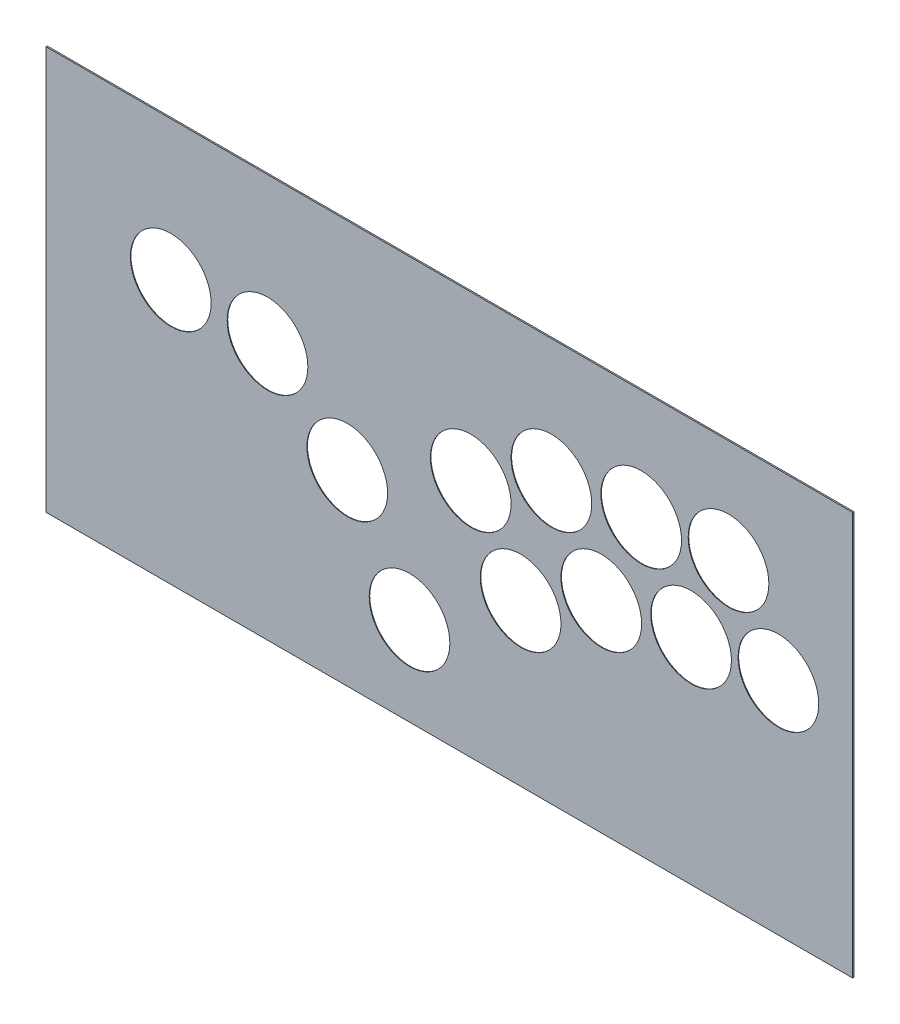
ISO-10303-21;
HEADER;
FILE_DESCRIPTION(('STEP AP214'),'2;1');
FILE_NAME('part.step','',(''),(''),'','','');
FILE_SCHEMA(('AUTOMOTIVE_DESIGN { 1 0 10303 214 1 1 1 1 }'));
ENDSEC;
DATA;
#1=APPLICATION_CONTEXT('core data for automotive mechanical design processes');
#2=APPLICATION_PROTOCOL_DEFINITION('international standard','automotive_design',2000,#1);
#3=PRODUCT_CONTEXT('',#1,'mechanical');
#4=PRODUCT('Part','Part','',(#3));
#5=PRODUCT_RELATED_PRODUCT_CATEGORY('part','',(#4));
#6=PRODUCT_DEFINITION_FORMATION('','',#4);
#7=PRODUCT_DEFINITION_CONTEXT('part definition',#1,'design');
#8=PRODUCT_DEFINITION('design','',#6,#7);
#9=PRODUCT_DEFINITION_SHAPE('','',#8);
#10=(LENGTH_UNIT() NAMED_UNIT(*) SI_UNIT(.MILLI.,.METRE.));
#11=(NAMED_UNIT(*) PLANE_ANGLE_UNIT() SI_UNIT($,.RADIAN.));
#12=(NAMED_UNIT(*) SI_UNIT($,.STERADIAN.) SOLID_ANGLE_UNIT());
#13=UNCERTAINTY_MEASURE_WITH_UNIT(LENGTH_MEASURE(1.E-05),#10,'distance_accuracy_value','');
#14=(GEOMETRIC_REPRESENTATION_CONTEXT(3) GLOBAL_UNCERTAINTY_ASSIGNED_CONTEXT((#13)) GLOBAL_UNIT_ASSIGNED_CONTEXT((#10,
#11,#12)) REPRESENTATION_CONTEXT('',''));
#15=CARTESIAN_POINT('',(0.,0.,0.));
#16=DIRECTION('',(0.,0.,1.));
#17=DIRECTION('',(1.,0.,0.));
#18=AXIS2_PLACEMENT_3D('',#15,#16,#17);
#19=CARTESIAN_POINT('',(0.,0.,8.));
#20=DIRECTION('',(0.,0.,-1.));
#21=DIRECTION('',(-1.,0.,0.));
#22=AXIS2_PLACEMENT_3D('',#19,#20,#21);
#23=PLANE('',#22);
#24=DIRECTION('',(0.,-1.,0.));
#25=VECTOR('',#24,1.);
#26=CARTESIAN_POINT('',(-2223.85023745411,-1021.97891702849,8.));
#27=LINE('',#26,#25);
#28=CARTESIAN_POINT('',(-2223.85023745411,1518.02108297151,8.));
#29=VERTEX_POINT('',#28);
#30=CARTESIAN_POINT('',(-2223.85023745411,-1021.97891702849,8.));
#31=VERTEX_POINT('',#30);
#32=EDGE_CURVE('E99',#29,#31,#27,.T.);
#33=ORIENTED_EDGE('',*,*,#32,.T.);
#34=DIRECTION('',(1.,0.,0.));
#35=VECTOR('',#34,1.);
#36=CARTESIAN_POINT('',(2856.14976254589,-1021.97891702849,8.));
#37=LINE('',#36,#35);
#38=CARTESIAN_POINT('',(2856.14976254589,-1021.97891702849,8.));
#39=VERTEX_POINT('',#38);
#40=EDGE_CURVE('E94',#31,#39,#37,.T.);
#41=ORIENTED_EDGE('',*,*,#40,.T.);
#42=DIRECTION('',(0.,1.,0.));
#43=VECTOR('',#42,1.);
#44=CARTESIAN_POINT('',(2856.14976254589,1518.02108297151,8.));
#45=LINE('',#44,#43);
#46=CARTESIAN_POINT('',(2856.14976254589,1518.02108297151,8.));
#47=VERTEX_POINT('',#46);
#48=EDGE_CURVE('E97',#39,#47,#45,.T.);
#49=ORIENTED_EDGE('',*,*,#48,.T.);
#50=DIRECTION('',(-1.,0.,0.));
#51=VECTOR('',#50,1.);
#52=CARTESIAN_POINT('',(-2223.85023745411,1518.02108297151,8.));
#53=LINE('',#52,#51);
#54=EDGE_CURVE('E64',#47,#29,#53,.T.);
#55=ORIENTED_EDGE('',*,*,#54,.T.);
#56=EDGE_LOOP('',(#33,#41,#49,#55));
#57=FACE_BOUND('',#56,.T.);
#58=CARTESIAN_POINT('',(-1438.69726844109,638.619730930492,8.));
#59=DIRECTION('',(0.,0.,1.));
#60=DIRECTION('',(1.,0.,0.));
#61=AXIS2_PLACEMENT_3D('',#58,#59,#60);
#62=CIRCLE('',#61,254.);
#63=CARTESIAN_POINT('',(-1184.69726844109,638.619730930492,8.));
#64=VERTEX_POINT('',#63);
#65=EDGE_CURVE('E125',#64,#64,#62,.T.);
#66=ORIENTED_EDGE('',*,*,#65,.F.);
#67=EDGE_LOOP('',(#66));
#68=FACE_BOUND('',#67,.T.);
#69=CARTESIAN_POINT('',(-829.234689966841,595.778397756596,8.));
#70=DIRECTION('',(0.,0.,1.));
#71=DIRECTION('',(1.,0.,0.));
#72=AXIS2_PLACEMENT_3D('',#69,#70,#71);
#73=CIRCLE('',#72,254.);
#74=CARTESIAN_POINT('',(-575.234689966841,595.778397756596,8.));
#75=VERTEX_POINT('',#74);
#76=EDGE_CURVE('E356',#75,#75,#73,.T.);
#77=ORIENTED_EDGE('',*,*,#76,.F.);
#78=EDGE_LOOP('',(#77));
#79=FACE_BOUND('',#78,.T.);
#80=CARTESIAN_POINT('',(-326.904160185785,157.844893080135,8.));
#81=DIRECTION('',(0.,0.,1.));
#82=DIRECTION('',(1.,0.,0.));
#83=AXIS2_PLACEMENT_3D('',#80,#81,#82);
#84=CIRCLE('',#83,254.);
#85=CARTESIAN_POINT('',(-72.9041601857845,157.844893080135,8.));
#86=VERTEX_POINT('',#85);
#87=EDGE_CURVE('E355',#86,#86,#84,.T.);
#88=ORIENTED_EDGE('',*,*,#87,.F.);
#89=EDGE_LOOP('',(#88));
#90=FACE_BOUND('',#89,.T.);
#91=CARTESIAN_POINT('',(65.1772087702372,-464.022155912422,8.));
#92=DIRECTION('',(0.,0.,1.));
#93=DIRECTION('',(1.,0.,0.));
#94=AXIS2_PLACEMENT_3D('',#91,#92,#93);
#95=CIRCLE('',#94,254.);
#96=CARTESIAN_POINT('',(319.177208770237,-464.022155912422,8.));
#97=VERTEX_POINT('',#96);
#98=EDGE_CURVE('E346',#97,#97,#95,.T.);
#99=ORIENTED_EDGE('',*,*,#98,.F.);
#100=EDGE_LOOP('',(#99));
#101=FACE_BOUND('',#100,.T.);
#102=CARTESIAN_POINT('',(450.852764313269,488.007227931822,8.));
#103=DIRECTION('',(0.,0.,1.));
#104=DIRECTION('',(1.,0.,0.));
#105=AXIS2_PLACEMENT_3D('',#102,#103,#104);
#106=CIRCLE('',#105,254.);
#107=CARTESIAN_POINT('',(704.852764313268,488.007227931822,8.));
#108=VERTEX_POINT('',#107);
#109=EDGE_CURVE('E344',#108,#108,#106,.T.);
#110=ORIENTED_EDGE('',*,*,#109,.F.);
#111=EDGE_LOOP('',(#110));
#112=FACE_BOUND('',#111,.T.);
#113=CARTESIAN_POINT('',(958.852764313268,742.007227931822,8.));
#114=DIRECTION('',(0.,0.,1.));
#115=DIRECTION('',(1.,0.,0.));
#116=AXIS2_PLACEMENT_3D('',#113,#114,#115);
#117=CIRCLE('',#116,254.);
#118=CARTESIAN_POINT('',(1212.85276431327,742.007227931822,8.));
#119=VERTEX_POINT('',#118);
#120=EDGE_CURVE('E338',#119,#119,#117,.T.);
#121=ORIENTED_EDGE('',*,*,#120,.F.);
#122=EDGE_LOOP('',(#121));
#123=FACE_BOUND('',#122,.T.);
#124=CARTESIAN_POINT('',(1524.55439569869,825.977687935269,8.));
#125=DIRECTION('',(0.,0.,1.));
#126=DIRECTION('',(1.,0.,0.));
#127=AXIS2_PLACEMENT_3D('',#124,#125,#126);
#128=CIRCLE('',#127,254.);
#129=CARTESIAN_POINT('',(1778.55439569869,825.977687935269,8.));
#130=VERTEX_POINT('',#129);
#131=EDGE_CURVE('E337',#130,#130,#128,.T.);
#132=ORIENTED_EDGE('',*,*,#131,.F.);
#133=EDGE_LOOP('',(#132));
#134=FACE_BOUND('',#133,.T.);
#135=CARTESIAN_POINT('',(2074.49917768818,864.058855361107,8.));
#136=DIRECTION('',(0.,0.,1.));
#137=DIRECTION('',(1.,0.,0.));
#138=AXIS2_PLACEMENT_3D('',#135,#136,#137);
#139=CIRCLE('',#138,254.);
#140=CARTESIAN_POINT('',(2328.49917768818,864.058855361107,8.));
#141=VERTEX_POINT('',#140);
#142=EDGE_CURVE('E335',#141,#141,#139,.T.);
#143=ORIENTED_EDGE('',*,*,#142,.F.);
#144=EDGE_LOOP('',(#143));
#145=FACE_BOUND('',#144,.T.);
#146=CARTESIAN_POINT('',(765.106903992089,-9.42811075742397,8.));
#147=DIRECTION('',(0.,0.,1.));
#148=DIRECTION('',(1.,0.,0.));
#149=AXIS2_PLACEMENT_3D('',#146,#147,#148);
#150=CIRCLE('',#149,254.);
#151=CARTESIAN_POINT('',(1019.10690399209,-9.42811075742397,8.));
#152=VERTEX_POINT('',#151);
#153=EDGE_CURVE('E326',#152,#152,#150,.T.);
#154=ORIENTED_EDGE('',*,*,#153,.F.);
#155=EDGE_LOOP('',(#154));
#156=FACE_BOUND('',#155,.T.);
#157=CARTESIAN_POINT('',(1273.10690399209,244.571889242576,8.));
#158=DIRECTION('',(0.,0.,1.));
#159=DIRECTION('',(1.,0.,0.));
#160=AXIS2_PLACEMENT_3D('',#157,#158,#159);
#161=CIRCLE('',#160,254.);
#162=CARTESIAN_POINT('',(1527.10690399209,244.571889242576,8.));
#163=VERTEX_POINT('',#162);
#164=EDGE_CURVE('E322',#163,#163,#161,.T.);
#165=ORIENTED_EDGE('',*,*,#164,.F.);
#166=EDGE_LOOP('',(#165));
#167=FACE_BOUND('',#166,.T.);
#168=CARTESIAN_POINT('',(1838.80853537751,328.542349246023,8.));
#169=DIRECTION('',(0.,0.,1.));
#170=DIRECTION('',(1.,0.,0.));
#171=AXIS2_PLACEMENT_3D('',#168,#169,#170);
#172=CIRCLE('',#171,254.);
#173=CARTESIAN_POINT('',(2092.80853537751,328.542349246023,8.));
#174=VERTEX_POINT('',#173);
#175=EDGE_CURVE('E318',#174,#174,#172,.T.);
#176=ORIENTED_EDGE('',*,*,#175,.F.);
#177=EDGE_LOOP('',(#176));
#178=FACE_BOUND('',#177,.T.);
#179=CARTESIAN_POINT('',(2388.753317367,366.623516671861,8.));
#180=DIRECTION('',(0.,0.,1.));
#181=DIRECTION('',(1.,0.,0.));
#182=AXIS2_PLACEMENT_3D('',#179,#180,#181);
#183=CIRCLE('',#182,254.);
#184=CARTESIAN_POINT('',(2642.753317367,366.623516671861,8.));
#185=VERTEX_POINT('',#184);
#186=EDGE_CURVE('E314',#185,#185,#183,.T.);
#187=ORIENTED_EDGE('',*,*,#186,.F.);
#188=EDGE_LOOP('',(#187));
#189=FACE_BOUND('',#188,.T.);
#190=ADVANCED_FACE('F44',(#57,#68,#79,#90,#101,#112,#123,#134,#145,#156,#167,#178,#189),#23,.F.);
#191=CARTESIAN_POINT('',(0.,0.,0.));
#192=DIRECTION('',(0.,0.,-1.));
#193=DIRECTION('',(-1.,0.,0.));
#194=AXIS2_PLACEMENT_3D('',#191,#192,#193);
#195=PLANE('',#194);
#196=CARTESIAN_POINT('',(-829.234689966841,595.778397756596,0.));
#197=DIRECTION('',(0.,0.,-1.));
#198=DIRECTION('',(-1.,0.,0.));
#199=AXIS2_PLACEMENT_3D('',#196,#197,#198);
#200=CIRCLE('',#199,259.);
#201=CARTESIAN_POINT('',(-1088.23468996684,595.778397756596,0.));
#202=VERTEX_POINT('',#201);
#203=EDGE_CURVE('E187',#202,#202,#200,.F.);
#204=ORIENTED_EDGE('',*,*,#203,.T.);
#205=EDGE_LOOP('',(#204));
#206=FACE_BOUND('',#205,.T.);
#207=CARTESIAN_POINT('',(-1438.69726844109,638.619730930492,0.));
#208=DIRECTION('',(0.,0.,-1.));
#209=DIRECTION('',(-1.,0.,0.));
#210=AXIS2_PLACEMENT_3D('',#207,#208,#209);
#211=CIRCLE('',#210,259.);
#212=CARTESIAN_POINT('',(-1697.69726844109,638.619730930492,0.));
#213=VERTEX_POINT('',#212);
#214=EDGE_CURVE('E182',#213,#213,#211,.F.);
#215=ORIENTED_EDGE('',*,*,#214,.T.);
#216=EDGE_LOOP('',(#215));
#217=FACE_BOUND('',#216,.T.);
#218=CARTESIAN_POINT('',(-326.904160185785,157.844893080135,0.));
#219=DIRECTION('',(0.,0.,-1.));
#220=DIRECTION('',(-1.,0.,0.));
#221=AXIS2_PLACEMENT_3D('',#218,#219,#220);
#222=CIRCLE('',#221,259.);
#223=CARTESIAN_POINT('',(-585.904160185785,157.844893080135,0.));
#224=VERTEX_POINT('',#223);
#225=EDGE_CURVE('E179',#224,#224,#222,.F.);
#226=ORIENTED_EDGE('',*,*,#225,.T.);
#227=EDGE_LOOP('',(#226));
#228=FACE_BOUND('',#227,.T.);
#229=CARTESIAN_POINT('',(65.1772087702372,-464.022155912422,0.));
#230=DIRECTION('',(0.,0.,-1.));
#231=DIRECTION('',(-1.,0.,0.));
#232=AXIS2_PLACEMENT_3D('',#229,#230,#231);
#233=CIRCLE('',#232,259.);
#234=CARTESIAN_POINT('',(-193.822791229763,-464.022155912422,0.));
#235=VERTEX_POINT('',#234);
#236=EDGE_CURVE('E180',#235,#235,#233,.F.);
#237=ORIENTED_EDGE('',*,*,#236,.T.);
#238=EDGE_LOOP('',(#237));
#239=FACE_BOUND('',#238,.T.);
#240=CARTESIAN_POINT('',(450.852764313269,488.007227931822,0.));
#241=DIRECTION('',(0.,0.,-1.));
#242=DIRECTION('',(-1.,0.,0.));
#243=AXIS2_PLACEMENT_3D('',#240,#241,#242);
#244=CIRCLE('',#243,259.);
#245=CARTESIAN_POINT('',(191.852764313268,488.007227931822,0.));
#246=VERTEX_POINT('',#245);
#247=EDGE_CURVE('E171',#246,#246,#244,.F.);
#248=ORIENTED_EDGE('',*,*,#247,.T.);
#249=EDGE_LOOP('',(#248));
#250=FACE_BOUND('',#249,.T.);
#251=CARTESIAN_POINT('',(765.106903992089,-9.42811075742397,0.));
#252=DIRECTION('',(0.,0.,-1.));
#253=DIRECTION('',(-1.,0.,0.));
#254=AXIS2_PLACEMENT_3D('',#251,#252,#253);
#255=CIRCLE('',#254,259.);
#256=CARTESIAN_POINT('',(506.106903992089,-9.42811075742397,0.));
#257=VERTEX_POINT('',#256);
#258=EDGE_CURVE('E170',#257,#257,#255,.F.);
#259=ORIENTED_EDGE('',*,*,#258,.T.);
#260=EDGE_LOOP('',(#259));
#261=FACE_BOUND('',#260,.T.);
#262=CARTESIAN_POINT('',(958.852764313268,742.007227931822,0.));
#263=DIRECTION('',(0.,0.,-1.));
#264=DIRECTION('',(-1.,0.,0.));
#265=AXIS2_PLACEMENT_3D('',#262,#263,#264);
#266=CIRCLE('',#265,259.);
#267=CARTESIAN_POINT('',(699.852764313268,742.007227931822,0.));
#268=VERTEX_POINT('',#267);
#269=EDGE_CURVE('E161',#268,#268,#266,.F.);
#270=ORIENTED_EDGE('',*,*,#269,.T.);
#271=EDGE_LOOP('',(#270));
#272=FACE_BOUND('',#271,.T.);
#273=CARTESIAN_POINT('',(1273.10690399209,244.571889242576,0.));
#274=DIRECTION('',(0.,0.,-1.));
#275=DIRECTION('',(-1.,0.,0.));
#276=AXIS2_PLACEMENT_3D('',#273,#274,#275);
#277=CIRCLE('',#276,259.);
#278=CARTESIAN_POINT('',(1014.10690399209,244.571889242576,0.));
#279=VERTEX_POINT('',#278);
#280=EDGE_CURVE('E162',#279,#279,#277,.F.);
#281=ORIENTED_EDGE('',*,*,#280,.T.);
#282=EDGE_LOOP('',(#281));
#283=FACE_BOUND('',#282,.T.);
#284=CARTESIAN_POINT('',(1838.80853537751,328.542349246023,0.));
#285=DIRECTION('',(0.,0.,-1.));
#286=DIRECTION('',(-1.,0.,0.));
#287=AXIS2_PLACEMENT_3D('',#284,#285,#286);
#288=CIRCLE('',#287,259.);
#289=CARTESIAN_POINT('',(1579.80853537751,328.542349246023,0.));
#290=VERTEX_POINT('',#289);
#291=EDGE_CURVE('E160',#290,#290,#288,.F.);
#292=ORIENTED_EDGE('',*,*,#291,.T.);
#293=EDGE_LOOP('',(#292));
#294=FACE_BOUND('',#293,.T.);
#295=CARTESIAN_POINT('',(1524.55439569869,825.977687935269,0.));
#296=DIRECTION('',(0.,0.,-1.));
#297=DIRECTION('',(-1.,0.,0.));
#298=AXIS2_PLACEMENT_3D('',#295,#296,#297);
#299=CIRCLE('',#298,258.999999999999);
#300=CARTESIAN_POINT('',(1265.55439569869,825.977687935269,0.));
#301=VERTEX_POINT('',#300);
#302=EDGE_CURVE('E153',#301,#301,#299,.F.);
#303=ORIENTED_EDGE('',*,*,#302,.T.);
#304=EDGE_LOOP('',(#303));
#305=FACE_BOUND('',#304,.T.);
#306=CARTESIAN_POINT('',(2074.49917768818,864.058855361107,0.));
#307=DIRECTION('',(0.,0.,-1.));
#308=DIRECTION('',(-1.,0.,0.));
#309=AXIS2_PLACEMENT_3D('',#306,#307,#308);
#310=CIRCLE('',#309,259.);
#311=CARTESIAN_POINT('',(1815.49917768818,864.058855361107,0.));
#312=VERTEX_POINT('',#311);
#313=EDGE_CURVE('E141',#312,#312,#310,.F.);
#314=ORIENTED_EDGE('',*,*,#313,.T.);
#315=EDGE_LOOP('',(#314));
#316=FACE_BOUND('',#315,.T.);
#317=CARTESIAN_POINT('',(2388.753317367,366.623516671861,0.));
#318=DIRECTION('',(0.,0.,-1.));
#319=DIRECTION('',(-1.,0.,0.));
#320=AXIS2_PLACEMENT_3D('',#317,#318,#319);
#321=CIRCLE('',#320,259.);
#322=CARTESIAN_POINT('',(2129.753317367,366.623516671861,0.));
#323=VERTEX_POINT('',#322);
#324=EDGE_CURVE('E140',#323,#323,#321,.F.);
#325=ORIENTED_EDGE('',*,*,#324,.T.);
#326=EDGE_LOOP('',(#325));
#327=FACE_BOUND('',#326,.T.);
#328=DIRECTION('',(0.,-1.,0.));
#329=VECTOR('',#328,1.);
#330=CARTESIAN_POINT('',(-2223.85023745411,-1021.97891702849,0.));
#331=LINE('',#330,#329);
#332=CARTESIAN_POINT('',(-2223.85023745411,1518.02108297151,0.));
#333=VERTEX_POINT('',#332);
#334=CARTESIAN_POINT('',(-2223.85023745411,-1021.97891702849,0.));
#335=VERTEX_POINT('',#334);
#336=EDGE_CURVE('E123',#333,#335,#331,.T.);
#337=ORIENTED_EDGE('',*,*,#336,.F.);
#338=DIRECTION('',(-1.,0.,0.));
#339=VECTOR('',#338,1.);
#340=CARTESIAN_POINT('',(-2223.85023745411,1518.02108297151,0.));
#341=LINE('',#340,#339);
#342=CARTESIAN_POINT('',(2856.14976254589,1518.02108297151,0.));
#343=VERTEX_POINT('',#342);
#344=EDGE_CURVE('E90',#343,#333,#341,.T.);
#345=ORIENTED_EDGE('',*,*,#344,.F.);
#346=DIRECTION('',(0.,1.,0.));
#347=VECTOR('',#346,1.);
#348=CARTESIAN_POINT('',(2856.14976254589,1518.02108297151,0.));
#349=LINE('',#348,#347);
#350=CARTESIAN_POINT('',(2856.14976254589,-1021.97891702849,0.));
#351=VERTEX_POINT('',#350);
#352=EDGE_CURVE('E83',#351,#343,#349,.T.);
#353=ORIENTED_EDGE('',*,*,#352,.F.);
#354=DIRECTION('',(1.,0.,0.));
#355=VECTOR('',#354,1.);
#356=CARTESIAN_POINT('',(2856.14976254589,-1021.97891702849,0.));
#357=LINE('',#356,#355);
#358=EDGE_CURVE('E107',#335,#351,#357,.T.);
#359=ORIENTED_EDGE('',*,*,#358,.F.);
#360=EDGE_LOOP('',(#337,#345,#353,#359));
#361=FACE_BOUND('',#360,.T.);
#362=ADVANCED_FACE('F237',(#206,#217,#228,#239,#250,#261,#272,#283,#294,#305,#316,#327,#361),
#195,.T.);
#363=CARTESIAN_POINT('',(-2223.85023745411,-1021.97891702849,8.));
#364=DIRECTION('',(1.,0.,0.));
#365=DIRECTION('',(0.,0.,-1.));
#366=AXIS2_PLACEMENT_3D('',#363,#364,#365);
#367=PLANE('',#366);
#368=ORIENTED_EDGE('',*,*,#336,.T.);
#369=DIRECTION('',(0.,0.,-1.));
#370=VECTOR('',#369,1.);
#371=CARTESIAN_POINT('',(-2223.85023745411,-1021.97891702849,8.));
#372=LINE('',#371,#370);
#373=EDGE_CURVE('E108',#31,#335,#372,.T.);
#374=ORIENTED_EDGE('',*,*,#373,.F.);
#375=ORIENTED_EDGE('',*,*,#32,.F.);
#376=DIRECTION('',(0.,0.,-1.));
#377=VECTOR('',#376,1.);
#378=CARTESIAN_POINT('',(-2223.85023745411,1518.02108297151,8.));
#379=LINE('',#378,#377);
#380=EDGE_CURVE('E120',#29,#333,#379,.T.);
#381=ORIENTED_EDGE('',*,*,#380,.T.);
#382=EDGE_LOOP('',(#368,#374,#375,#381));
#383=FACE_BOUND('',#382,.T.);
#384=ADVANCED_FACE('F236',(#383),#367,.F.);
#385=CARTESIAN_POINT('',(2856.14976254589,-1021.97891702849,8.));
#386=DIRECTION('',(0.,1.,0.));
#387=DIRECTION('',(-1.,0.,0.));
#388=AXIS2_PLACEMENT_3D('',#385,#386,#387);
#389=PLANE('',#388);
#390=ORIENTED_EDGE('',*,*,#358,.T.);
#391=DIRECTION('',(0.,0.,-1.));
#392=VECTOR('',#391,1.);
#393=CARTESIAN_POINT('',(2856.14976254589,-1021.97891702849,8.));
#394=LINE('',#393,#392);
#395=EDGE_CURVE('E101',#39,#351,#394,.T.);
#396=ORIENTED_EDGE('',*,*,#395,.F.);
#397=ORIENTED_EDGE('',*,*,#40,.F.);
#398=ORIENTED_EDGE('',*,*,#373,.T.);
#399=EDGE_LOOP('',(#390,#396,#397,#398));
#400=FACE_BOUND('',#399,.T.);
#401=ADVANCED_FACE('F103',(#400),#389,.F.);
#402=CARTESIAN_POINT('',(2856.14976254589,1518.02108297151,8.));
#403=DIRECTION('',(-1.,0.,0.));
#404=DIRECTION('',(0.,0.,1.));
#405=AXIS2_PLACEMENT_3D('',#402,#403,#404);
#406=PLANE('',#405);
#407=ORIENTED_EDGE('',*,*,#352,.T.);
#408=DIRECTION('',(0.,0.,-1.));
#409=VECTOR('',#408,1.);
#410=CARTESIAN_POINT('',(2856.14976254589,1518.02108297151,8.));
#411=LINE('',#410,#409);
#412=EDGE_CURVE('E109',#47,#343,#411,.T.);
#413=ORIENTED_EDGE('',*,*,#412,.F.);
#414=ORIENTED_EDGE('',*,*,#48,.F.);
#415=ORIENTED_EDGE('',*,*,#395,.T.);
#416=EDGE_LOOP('',(#407,#413,#414,#415));
#417=FACE_BOUND('',#416,.T.);
#418=ADVANCED_FACE('F112',(#417),#406,.F.);
#419=CARTESIAN_POINT('',(-2223.85023745411,1518.02108297151,8.));
#420=DIRECTION('',(0.,-1.,0.));
#421=DIRECTION('',(0.,0.,-1.));
#422=AXIS2_PLACEMENT_3D('',#419,#420,#421);
#423=PLANE('',#422);
#424=ORIENTED_EDGE('',*,*,#344,.T.);
#425=ORIENTED_EDGE('',*,*,#380,.F.);
#426=ORIENTED_EDGE('',*,*,#54,.F.);
#427=ORIENTED_EDGE('',*,*,#412,.T.);
#428=EDGE_LOOP('',(#424,#425,#426,#427));
#429=FACE_BOUND('',#428,.T.);
#430=ADVANCED_FACE('F248',(#429),#423,.F.);
#431=CARTESIAN_POINT('',(-1438.69726844109,638.619730930492,8.));
#432=DIRECTION('',(0.,0.,-1.));
#433=DIRECTION('',(-1.,0.,0.));
#434=AXIS2_PLACEMENT_3D('',#431,#432,#433);
#435=CYLINDRICAL_SURFACE('',#434,254.);
#436=CARTESIAN_POINT('',(-1438.69726844109,638.619730930492,5.00000000000078));
#437=DIRECTION('',(0.,0.,-1.));
#438=DIRECTION('',(-1.,0.,0.));
#439=AXIS2_PLACEMENT_3D('',#436,#437,#438);
#440=CIRCLE('',#439,254.);
#441=CARTESIAN_POINT('',(-1692.69726844109,638.619730930492,5.00000000000078));
#442=VERTEX_POINT('',#441);
#443=EDGE_CURVE('E197',#442,#442,#440,.T.);
#444=ORIENTED_EDGE('',*,*,#443,.T.);
#445=EDGE_LOOP('',(#444));
#446=FACE_BOUND('',#445,.T.);
#447=ORIENTED_EDGE('',*,*,#65,.T.);
#448=EDGE_LOOP('',(#447));
#449=FACE_BOUND('',#448,.T.);
#450=ADVANCED_FACE('F255',(#446,#449),#435,.F.);
#451=CARTESIAN_POINT('',(-829.234689966841,595.778397756596,8.));
#452=DIRECTION('',(0.,0.,-1.));
#453=DIRECTION('',(-1.,0.,0.));
#454=AXIS2_PLACEMENT_3D('',#451,#452,#453);
#455=CYLINDRICAL_SURFACE('',#454,254.);
#456=CARTESIAN_POINT('',(-829.234689966841,595.778397756596,5.00000000000078));
#457=DIRECTION('',(0.,0.,-1.));
#458=DIRECTION('',(-1.,0.,0.));
#459=AXIS2_PLACEMENT_3D('',#456,#457,#458);
#460=CIRCLE('',#459,254.);
#461=CARTESIAN_POINT('',(-1083.23468996684,595.778397756596,5.00000000000078));
#462=VERTEX_POINT('',#461);
#463=EDGE_CURVE('E195',#462,#462,#460,.T.);
#464=ORIENTED_EDGE('',*,*,#463,.T.);
#465=EDGE_LOOP('',(#464));
#466=FACE_BOUND('',#465,.T.);
#467=ORIENTED_EDGE('',*,*,#76,.T.);
#468=EDGE_LOOP('',(#467));
#469=FACE_BOUND('',#468,.T.);
#470=ADVANCED_FACE('F257',(#466,#469),#455,.F.);
#471=CARTESIAN_POINT('',(-326.904160185785,157.844893080135,8.));
#472=DIRECTION('',(0.,0.,-1.));
#473=DIRECTION('',(-1.,0.,0.));
#474=AXIS2_PLACEMENT_3D('',#471,#472,#473);
#475=CYLINDRICAL_SURFACE('',#474,254.);
#476=CARTESIAN_POINT('',(-326.904160185785,157.844893080135,5.00000000000078));
#477=DIRECTION('',(0.,0.,-1.));
#478=DIRECTION('',(-1.,0.,0.));
#479=AXIS2_PLACEMENT_3D('',#476,#477,#478);
#480=CIRCLE('',#479,254.);
#481=CARTESIAN_POINT('',(-580.904160185784,157.844893080135,5.00000000000078));
#482=VERTEX_POINT('',#481);
#483=EDGE_CURVE('E196',#482,#482,#480,.T.);
#484=ORIENTED_EDGE('',*,*,#483,.T.);
#485=EDGE_LOOP('',(#484));
#486=FACE_BOUND('',#485,.T.);
#487=ORIENTED_EDGE('',*,*,#87,.T.);
#488=EDGE_LOOP('',(#487));
#489=FACE_BOUND('',#488,.T.);
#490=ADVANCED_FACE('F270',(#486,#489),#475,.F.);
#491=CARTESIAN_POINT('',(65.1772087702372,-464.022155912422,8.));
#492=DIRECTION('',(0.,0.,-1.));
#493=DIRECTION('',(-1.,0.,0.));
#494=AXIS2_PLACEMENT_3D('',#491,#492,#493);
#495=CYLINDRICAL_SURFACE('',#494,254.);
#496=CARTESIAN_POINT('',(65.1772087702372,-464.022155912422,5.00000000000017));
#497=DIRECTION('',(0.,0.,-1.));
#498=DIRECTION('',(-1.,0.,0.));
#499=AXIS2_PLACEMENT_3D('',#496,#497,#498);
#500=CIRCLE('',#499,254.);
#501=CARTESIAN_POINT('',(-188.822791229763,-464.022155912422,5.00000000000017));
#502=VERTEX_POINT('',#501);
#503=EDGE_CURVE('E204',#502,#502,#500,.T.);
#504=ORIENTED_EDGE('',*,*,#503,.T.);
#505=EDGE_LOOP('',(#504));
#506=FACE_BOUND('',#505,.T.);
#507=ORIENTED_EDGE('',*,*,#98,.T.);
#508=EDGE_LOOP('',(#507));
#509=FACE_BOUND('',#508,.T.);
#510=ADVANCED_FACE('F271',(#506,#509),#495,.F.);
#511=CARTESIAN_POINT('',(450.852764313269,488.007227931822,8.));
#512=DIRECTION('',(0.,0.,-1.));
#513=DIRECTION('',(-1.,0.,0.));
#514=AXIS2_PLACEMENT_3D('',#511,#512,#513);
#515=CYLINDRICAL_SURFACE('',#514,254.);
#516=CARTESIAN_POINT('',(450.852764313269,488.007227931822,5.00000000000023));
#517=DIRECTION('',(0.,0.,-1.));
#518=DIRECTION('',(-1.,0.,0.));
#519=AXIS2_PLACEMENT_3D('',#516,#517,#518);
#520=CIRCLE('',#519,254.);
#521=CARTESIAN_POINT('',(196.852764313269,488.007227931822,5.00000000000023));
#522=VERTEX_POINT('',#521);
#523=EDGE_CURVE('E208',#522,#522,#520,.T.);
#524=ORIENTED_EDGE('',*,*,#523,.T.);
#525=EDGE_LOOP('',(#524));
#526=FACE_BOUND('',#525,.T.);
#527=ORIENTED_EDGE('',*,*,#109,.T.);
#528=EDGE_LOOP('',(#527));
#529=FACE_BOUND('',#528,.T.);
#530=ADVANCED_FACE('F274',(#526,#529),#515,.F.);
#531=CARTESIAN_POINT('',(958.852764313268,742.007227931822,8.));
#532=DIRECTION('',(0.,0.,-1.));
#533=DIRECTION('',(-1.,0.,0.));
#534=AXIS2_PLACEMENT_3D('',#531,#532,#533);
#535=CYLINDRICAL_SURFACE('',#534,254.);
#536=CARTESIAN_POINT('',(958.852764313268,742.007227931822,5.00000000000078));
#537=DIRECTION('',(0.,0.,-1.));
#538=DIRECTION('',(-1.,0.,0.));
#539=AXIS2_PLACEMENT_3D('',#536,#537,#538);
#540=CIRCLE('',#539,254.);
#541=CARTESIAN_POINT('',(704.852764313268,742.007227931822,5.00000000000078));
#542=VERTEX_POINT('',#541);
#543=EDGE_CURVE('E218',#542,#542,#540,.T.);
#544=ORIENTED_EDGE('',*,*,#543,.T.);
#545=EDGE_LOOP('',(#544));
#546=FACE_BOUND('',#545,.T.);
#547=ORIENTED_EDGE('',*,*,#120,.T.);
#548=EDGE_LOOP('',(#547));
#549=FACE_BOUND('',#548,.T.);
#550=ADVANCED_FACE('F278',(#546,#549),#535,.F.);
#551=CARTESIAN_POINT('',(1524.55439569869,825.977687935269,8.));
#552=DIRECTION('',(0.,0.,-1.));
#553=DIRECTION('',(-1.,0.,0.));
#554=AXIS2_PLACEMENT_3D('',#551,#552,#553);
#555=CYLINDRICAL_SURFACE('',#554,254.);
#556=CARTESIAN_POINT('',(1524.55439569869,825.977687935269,4.99999999999945));
#557=DIRECTION('',(0.,0.,-1.));
#558=DIRECTION('',(-1.,0.,0.));
#559=AXIS2_PLACEMENT_3D('',#556,#557,#558);
#560=CIRCLE('',#559,254.);
#561=CARTESIAN_POINT('',(1270.55439569869,825.977687935269,4.99999999999945));
#562=VERTEX_POINT('',#561);
#563=EDGE_CURVE('E11',#562,#562,#560,.T.);
#564=ORIENTED_EDGE('',*,*,#563,.T.);
#565=EDGE_LOOP('',(#564));
#566=FACE_BOUND('',#565,.T.);
#567=ORIENTED_EDGE('',*,*,#131,.T.);
#568=EDGE_LOOP('',(#567));
#569=FACE_BOUND('',#568,.T.);
#570=ADVANCED_FACE('F284',(#566,#569),#555,.F.);
#571=CARTESIAN_POINT('',(2074.49917768818,864.058855361107,8.));
#572=DIRECTION('',(0.,0.,-1.));
#573=DIRECTION('',(-1.,0.,0.));
#574=AXIS2_PLACEMENT_3D('',#571,#572,#573);
#575=CYLINDRICAL_SURFACE('',#574,254.);
#576=CARTESIAN_POINT('',(2074.49917768818,864.058855361107,5.00000000000078));
#577=DIRECTION('',(0.,0.,-1.));
#578=DIRECTION('',(-1.,0.,0.));
#579=AXIS2_PLACEMENT_3D('',#576,#577,#578);
#580=CIRCLE('',#579,254.);
#581=CARTESIAN_POINT('',(1820.49917768818,864.058855361107,5.00000000000078));
#582=VERTEX_POINT('',#581);
#583=EDGE_CURVE('E144',#582,#582,#580,.T.);
#584=ORIENTED_EDGE('',*,*,#583,.T.);
#585=EDGE_LOOP('',(#584));
#586=FACE_BOUND('',#585,.T.);
#587=ORIENTED_EDGE('',*,*,#142,.T.);
#588=EDGE_LOOP('',(#587));
#589=FACE_BOUND('',#588,.T.);
#590=ADVANCED_FACE('F290',(#586,#589),#575,.F.);
#591=CARTESIAN_POINT('',(765.106903992089,-9.42811075742397,8.));
#592=DIRECTION('',(0.,0.,-1.));
#593=DIRECTION('',(-1.,0.,0.));
#594=AXIS2_PLACEMENT_3D('',#591,#592,#593);
#595=CYLINDRICAL_SURFACE('',#594,254.);
#596=CARTESIAN_POINT('',(765.106903992089,-9.42811075742397,5.00000000000067));
#597=DIRECTION('',(0.,0.,-1.));
#598=DIRECTION('',(-1.,0.,0.));
#599=AXIS2_PLACEMENT_3D('',#596,#597,#598);
#600=CIRCLE('',#599,254.);
#601=CARTESIAN_POINT('',(511.106903992089,-9.42811075742397,5.00000000000067));
#602=VERTEX_POINT('',#601);
#603=EDGE_CURVE('E212',#602,#602,#600,.T.);
#604=ORIENTED_EDGE('',*,*,#603,.T.);
#605=EDGE_LOOP('',(#604));
#606=FACE_BOUND('',#605,.T.);
#607=ORIENTED_EDGE('',*,*,#153,.T.);
#608=EDGE_LOOP('',(#607));
#609=FACE_BOUND('',#608,.T.);
#610=ADVANCED_FACE('F292',(#606,#609),#595,.F.);
#611=CARTESIAN_POINT('',(1273.10690399209,244.571889242576,8.));
#612=DIRECTION('',(0.,0.,-1.));
#613=DIRECTION('',(-1.,0.,0.));
#614=AXIS2_PLACEMENT_3D('',#611,#612,#613);
#615=CYLINDRICAL_SURFACE('',#614,254.);
#616=CARTESIAN_POINT('',(1273.10690399209,244.571889242576,5.00000000000078));
#617=DIRECTION('',(0.,0.,-1.));
#618=DIRECTION('',(-1.,0.,0.));
#619=AXIS2_PLACEMENT_3D('',#616,#617,#618);
#620=CIRCLE('',#619,254.);
#621=CARTESIAN_POINT('',(1019.10690399209,244.571889242576,5.00000000000078));
#622=VERTEX_POINT('',#621);
#623=EDGE_CURVE('E217',#622,#622,#620,.T.);
#624=ORIENTED_EDGE('',*,*,#623,.T.);
#625=EDGE_LOOP('',(#624));
#626=FACE_BOUND('',#625,.T.);
#627=ORIENTED_EDGE('',*,*,#164,.T.);
#628=EDGE_LOOP('',(#627));
#629=FACE_BOUND('',#628,.T.);
#630=ADVANCED_FACE('F293',(#626,#629),#615,.F.);
#631=CARTESIAN_POINT('',(1838.80853537751,328.542349246023,8.));
#632=DIRECTION('',(0.,0.,-1.));
#633=DIRECTION('',(-1.,0.,0.));
#634=AXIS2_PLACEMENT_3D('',#631,#632,#633);
#635=CYLINDRICAL_SURFACE('',#634,254.);
#636=CARTESIAN_POINT('',(1838.80853537751,328.542349246023,5.00000000000056));
#637=DIRECTION('',(0.,0.,-1.));
#638=DIRECTION('',(-1.,0.,0.));
#639=AXIS2_PLACEMENT_3D('',#636,#637,#638);
#640=CIRCLE('',#639,254.);
#641=CARTESIAN_POINT('',(1584.80853537751,328.542349246023,5.00000000000056));
#642=VERTEX_POINT('',#641);
#643=EDGE_CURVE('E57',#642,#642,#640,.T.);
#644=ORIENTED_EDGE('',*,*,#643,.T.);
#645=EDGE_LOOP('',(#644));
#646=FACE_BOUND('',#645,.T.);
#647=ORIENTED_EDGE('',*,*,#175,.T.);
#648=EDGE_LOOP('',(#647));
#649=FACE_BOUND('',#648,.T.);
#650=ADVANCED_FACE('F230',(#646,#649),#635,.F.);
#651=CARTESIAN_POINT('',(2388.753317367,366.623516671861,8.));
#652=DIRECTION('',(0.,0.,-1.));
#653=DIRECTION('',(-1.,0.,0.));
#654=AXIS2_PLACEMENT_3D('',#651,#652,#653);
#655=CYLINDRICAL_SURFACE('',#654,254.);
#656=CARTESIAN_POINT('',(2388.753317367,366.623516671861,5.00000000000078));
#657=DIRECTION('',(0.,0.,-1.));
#658=DIRECTION('',(-1.,0.,0.));
#659=AXIS2_PLACEMENT_3D('',#656,#657,#658);
#660=CIRCLE('',#659,254.);
#661=CARTESIAN_POINT('',(2134.753317367,366.623516671861,5.00000000000078));
#662=VERTEX_POINT('',#661);
#663=EDGE_CURVE('E146',#662,#662,#660,.T.);
#664=ORIENTED_EDGE('',*,*,#663,.T.);
#665=EDGE_LOOP('',(#664));
#666=FACE_BOUND('',#665,.T.);
#667=ORIENTED_EDGE('',*,*,#186,.T.);
#668=EDGE_LOOP('',(#667));
#669=FACE_BOUND('',#668,.T.);
#670=ADVANCED_FACE('F302',(#666,#669),#655,.F.);
#671=CARTESIAN_POINT('',(2074.49917768818,864.058855361107,0.));
#672=DIRECTION('',(0.,0.,-1.));
#673=DIRECTION('',(-1.,0.,0.));
#674=AXIS2_PLACEMENT_3D('',#671,#672,#673);
#675=CONICAL_SURFACE('',#674,259.,0.785398163397404);
#676=ORIENTED_EDGE('',*,*,#583,.F.);
#677=EDGE_LOOP('',(#676));
#678=FACE_BOUND('',#677,.T.);
#679=ORIENTED_EDGE('',*,*,#313,.F.);
#680=EDGE_LOOP('',(#679));
#681=FACE_BOUND('',#680,.T.);
#682=ADVANCED_FACE('F305',(#678,#681),#675,.F.);
#683=CARTESIAN_POINT('',(2388.753317367,366.623516671861,0.));
#684=DIRECTION('',(0.,0.,-1.));
#685=DIRECTION('',(-1.,0.,0.));
#686=AXIS2_PLACEMENT_3D('',#683,#684,#685);
#687=CONICAL_SURFACE('',#686,259.,0.785398163397404);
#688=ORIENTED_EDGE('',*,*,#663,.F.);
#689=EDGE_LOOP('',(#688));
#690=FACE_BOUND('',#689,.T.);
#691=ORIENTED_EDGE('',*,*,#324,.F.);
#692=EDGE_LOOP('',(#691));
#693=FACE_BOUND('',#692,.T.);
#694=ADVANCED_FACE('F306',(#690,#693),#687,.F.);
#695=CARTESIAN_POINT('',(-829.234689966841,595.778397756596,0.));
#696=DIRECTION('',(0.,0.,-1.));
#697=DIRECTION('',(-1.,0.,0.));
#698=AXIS2_PLACEMENT_3D('',#695,#696,#697);
#699=CONICAL_SURFACE('',#698,259.,0.785398163397415);
#700=ORIENTED_EDGE('',*,*,#463,.F.);
#701=EDGE_LOOP('',(#700));
#702=FACE_BOUND('',#701,.T.);
#703=ORIENTED_EDGE('',*,*,#203,.F.);
#704=EDGE_LOOP('',(#703));
#705=FACE_BOUND('',#704,.T.);
#706=ADVANCED_FACE('F400',(#702,#705),#699,.F.);
#707=CARTESIAN_POINT('',(-1438.69726844109,638.619730930492,0.));
#708=DIRECTION('',(0.,0.,-1.));
#709=DIRECTION('',(-1.,0.,0.));
#710=AXIS2_PLACEMENT_3D('',#707,#708,#709);
#711=CONICAL_SURFACE('',#710,259.,0.785398163397404);
#712=ORIENTED_EDGE('',*,*,#443,.F.);
#713=EDGE_LOOP('',(#712));
#714=FACE_BOUND('',#713,.T.);
#715=ORIENTED_EDGE('',*,*,#214,.F.);
#716=EDGE_LOOP('',(#715));
#717=FACE_BOUND('',#716,.T.);
#718=ADVANCED_FACE('F401',(#714,#717),#711,.F.);
#719=CARTESIAN_POINT('',(-326.904160185785,157.844893080135,0.));
#720=DIRECTION('',(0.,0.,-1.));
#721=DIRECTION('',(-1.,0.,0.));
#722=AXIS2_PLACEMENT_3D('',#719,#720,#721);
#723=CONICAL_SURFACE('',#722,259.,0.785398163397404);
#724=ORIENTED_EDGE('',*,*,#483,.F.);
#725=EDGE_LOOP('',(#724));
#726=FACE_BOUND('',#725,.T.);
#727=ORIENTED_EDGE('',*,*,#225,.F.);
#728=EDGE_LOOP('',(#727));
#729=FACE_BOUND('',#728,.T.);
#730=ADVANCED_FACE('F416',(#726,#729),#723,.F.);
#731=CARTESIAN_POINT('',(65.1772087702372,-464.022155912422,0.));
#732=DIRECTION('',(0.,0.,-1.));
#733=DIRECTION('',(-1.,0.,0.));
#734=AXIS2_PLACEMENT_3D('',#731,#732,#733);
#735=CONICAL_SURFACE('',#734,259.,0.785398163397465);
#736=ORIENTED_EDGE('',*,*,#503,.F.);
#737=EDGE_LOOP('',(#736));
#738=FACE_BOUND('',#737,.T.);
#739=ORIENTED_EDGE('',*,*,#236,.F.);
#740=EDGE_LOOP('',(#739));
#741=FACE_BOUND('',#740,.T.);
#742=ADVANCED_FACE('F427',(#738,#741),#735,.F.);
#743=CARTESIAN_POINT('',(450.852764313269,488.007227931822,0.));
#744=DIRECTION('',(0.,0.,-1.));
#745=DIRECTION('',(-1.,0.,0.));
#746=AXIS2_PLACEMENT_3D('',#743,#744,#745);
#747=CONICAL_SURFACE('',#746,259.,0.785398163397465);
#748=ORIENTED_EDGE('',*,*,#523,.F.);
#749=EDGE_LOOP('',(#748));
#750=FACE_BOUND('',#749,.T.);
#751=ORIENTED_EDGE('',*,*,#247,.F.);
#752=EDGE_LOOP('',(#751));
#753=FACE_BOUND('',#752,.T.);
#754=ADVANCED_FACE('F433',(#750,#753),#747,.F.);
#755=CARTESIAN_POINT('',(765.106903992089,-9.42811075742397,0.));
#756=DIRECTION('',(0.,0.,-1.));
#757=DIRECTION('',(-1.,0.,0.));
#758=AXIS2_PLACEMENT_3D('',#755,#756,#757);
#759=CONICAL_SURFACE('',#758,259.,0.785398163397404);
#760=ORIENTED_EDGE('',*,*,#603,.F.);
#761=EDGE_LOOP('',(#760));
#762=FACE_BOUND('',#761,.T.);
#763=ORIENTED_EDGE('',*,*,#258,.F.);
#764=EDGE_LOOP('',(#763));
#765=FACE_BOUND('',#764,.T.);
#766=ADVANCED_FACE('F439',(#762,#765),#759,.F.);
#767=CARTESIAN_POINT('',(958.852764313268,742.007227931822,0.));
#768=DIRECTION('',(0.,0.,-1.));
#769=DIRECTION('',(-1.,0.,0.));
#770=AXIS2_PLACEMENT_3D('',#767,#768,#769);
#771=CONICAL_SURFACE('',#770,259.,0.785398163397404);
#772=ORIENTED_EDGE('',*,*,#543,.F.);
#773=EDGE_LOOP('',(#772));
#774=FACE_BOUND('',#773,.T.);
#775=ORIENTED_EDGE('',*,*,#269,.F.);
#776=EDGE_LOOP('',(#775));
#777=FACE_BOUND('',#776,.T.);
#778=ADVANCED_FACE('F450',(#774,#777),#771,.F.);
#779=CARTESIAN_POINT('',(1273.10690399209,244.571889242576,0.));
#780=DIRECTION('',(0.,0.,-1.));
#781=DIRECTION('',(-1.,0.,0.));
#782=AXIS2_PLACEMENT_3D('',#779,#780,#781);
#783=CONICAL_SURFACE('',#782,259.,0.785398163397404);
#784=ORIENTED_EDGE('',*,*,#623,.F.);
#785=EDGE_LOOP('',(#784));
#786=FACE_BOUND('',#785,.T.);
#787=ORIENTED_EDGE('',*,*,#280,.F.);
#788=EDGE_LOOP('',(#787));
#789=FACE_BOUND('',#788,.T.);
#790=ADVANCED_FACE('F232',(#786,#789),#783,.F.);
#791=CARTESIAN_POINT('',(1838.80853537751,328.542349246023,0.));
#792=DIRECTION('',(0.,0.,-1.));
#793=DIRECTION('',(-1.,0.,0.));
#794=AXIS2_PLACEMENT_3D('',#791,#792,#793);
#795=CONICAL_SURFACE('',#794,259.,0.785398163397404);
#796=ORIENTED_EDGE('',*,*,#643,.F.);
#797=EDGE_LOOP('',(#796));
#798=FACE_BOUND('',#797,.T.);
#799=ORIENTED_EDGE('',*,*,#291,.F.);
#800=EDGE_LOOP('',(#799));
#801=FACE_BOUND('',#800,.T.);
#802=ADVANCED_FACE('F229',(#798,#801),#795,.F.);
#803=CARTESIAN_POINT('',(1524.55439569869,825.977687935269,0.));
#804=DIRECTION('',(0.,0.,-1.));
#805=DIRECTION('',(-1.,0.,0.));
#806=AXIS2_PLACEMENT_3D('',#803,#804,#805);
#807=CONICAL_SURFACE('',#806,258.999999999999,0.785398163397404);
#808=ORIENTED_EDGE('',*,*,#563,.F.);
#809=EDGE_LOOP('',(#808));
#810=FACE_BOUND('',#809,.T.);
#811=ORIENTED_EDGE('',*,*,#302,.F.);
#812=EDGE_LOOP('',(#811));
#813=FACE_BOUND('',#812,.T.);
#814=ADVANCED_FACE('F48',(#810,#813),#807,.F.);
#815=CLOSED_SHELL('',(#190,#362,#384,#401,#418,#430,#450,#470,#490,#510,#530,#550,#570,#590,
#610,#630,#650,#670,#682,#694,#706,#718,#730,#742,#754,#766,#778,#790,#802,#814));
#816=MANIFOLD_SOLID_BREP('B2',#815);
#817=ADVANCED_BREP_SHAPE_REPRESENTATION('',(#18,#816),#14);
#818=SHAPE_DEFINITION_REPRESENTATION(#9,#817);
ENDSEC;
END-ISO-10303-21;
